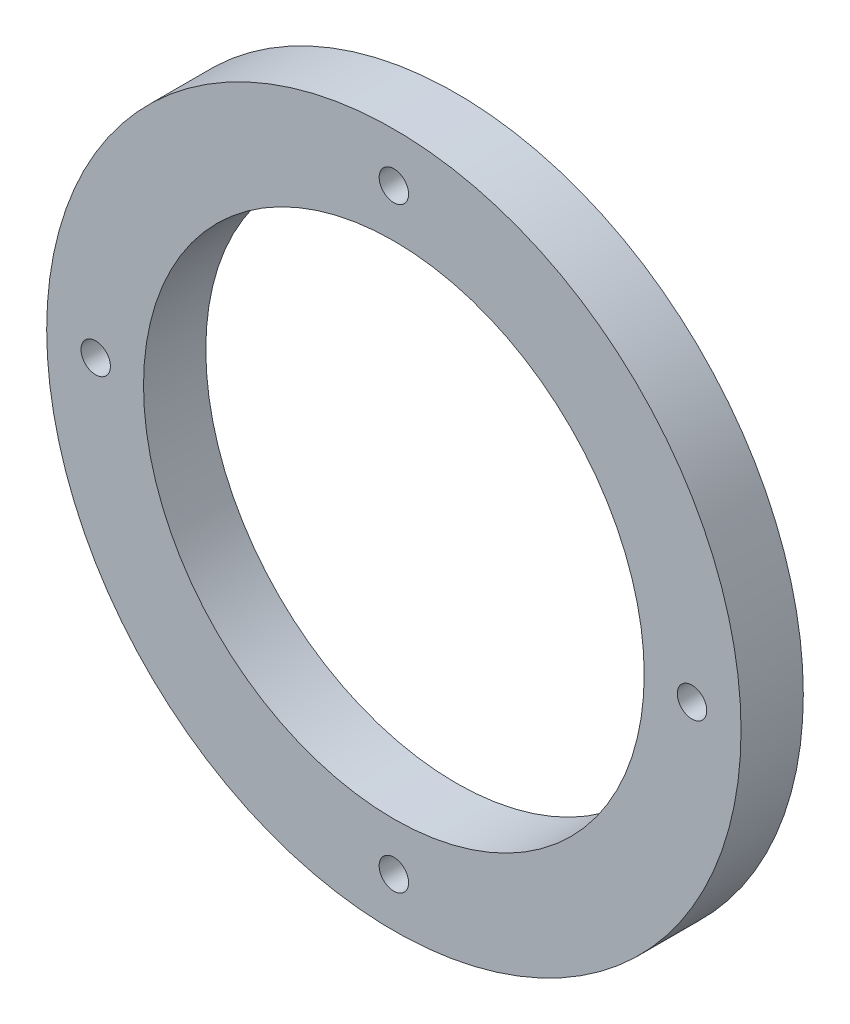
ISO-10303-21;
HEADER;
FILE_DESCRIPTION(('STEP AP214'),'2;1');
FILE_NAME('part.step','',(''),(''),'','','');
FILE_SCHEMA(('AUTOMOTIVE_DESIGN { 1 0 10303 214 1 1 1 1 }'));
ENDSEC;
DATA;
#1=APPLICATION_CONTEXT('core data for automotive mechanical design processes');
#2=APPLICATION_PROTOCOL_DEFINITION('international standard','automotive_design',2000,#1);
#3=PRODUCT_CONTEXT('',#1,'mechanical');
#4=PRODUCT('Part','Part','',(#3));
#5=PRODUCT_RELATED_PRODUCT_CATEGORY('part','',(#4));
#6=PRODUCT_DEFINITION_FORMATION('','',#4);
#7=PRODUCT_DEFINITION_CONTEXT('part definition',#1,'design');
#8=PRODUCT_DEFINITION('design','',#6,#7);
#9=PRODUCT_DEFINITION_SHAPE('','',#8);
#10=(LENGTH_UNIT() NAMED_UNIT(*) SI_UNIT(.MILLI.,.METRE.));
#11=(NAMED_UNIT(*) PLANE_ANGLE_UNIT() SI_UNIT($,.RADIAN.));
#12=(NAMED_UNIT(*) SI_UNIT($,.STERADIAN.) SOLID_ANGLE_UNIT());
#13=UNCERTAINTY_MEASURE_WITH_UNIT(LENGTH_MEASURE(1.E-05),#10,'distance_accuracy_value','');
#14=(GEOMETRIC_REPRESENTATION_CONTEXT(3) GLOBAL_UNCERTAINTY_ASSIGNED_CONTEXT((#13)) GLOBAL_UNIT_ASSIGNED_CONTEXT((#10,
#11,#12)) REPRESENTATION_CONTEXT('',''));
#15=CARTESIAN_POINT('',(0.,0.,0.));
#16=DIRECTION('',(0.,0.,1.));
#17=DIRECTION('',(1.,0.,0.));
#18=AXIS2_PLACEMENT_3D('',#15,#16,#17);
#19=CARTESIAN_POINT('',(0.,0.,6.35));
#20=DIRECTION('',(0.,0.,-1.));
#21=DIRECTION('',(-1.,0.,0.));
#22=AXIS2_PLACEMENT_3D('',#19,#20,#21);
#23=CYLINDRICAL_SURFACE('',#22,35.399999939);
#24=CARTESIAN_POINT('',(0.,0.,6.35));
#25=DIRECTION('',(0.,0.,1.));
#26=DIRECTION('',(1.,0.,0.));
#27=AXIS2_PLACEMENT_3D('',#24,#25,#26);
#28=CIRCLE('',#27,35.399999939);
#29=CARTESIAN_POINT('',(35.399999939,0.,6.35));
#30=VERTEX_POINT('',#29);
#31=EDGE_CURVE('E10',#30,#30,#28,.T.);
#32=ORIENTED_EDGE('',*,*,#31,.F.);
#33=EDGE_LOOP('',(#32));
#34=FACE_BOUND('',#33,.T.);
#35=CARTESIAN_POINT('',(0.,0.,0.));
#36=DIRECTION('',(0.,0.,1.));
#37=DIRECTION('',(1.,0.,0.));
#38=AXIS2_PLACEMENT_3D('',#35,#36,#37);
#39=CIRCLE('',#38,35.399999939);
#40=CARTESIAN_POINT('',(35.399999939,0.,0.));
#41=VERTEX_POINT('',#40);
#42=EDGE_CURVE('E34',#41,#41,#39,.T.);
#43=ORIENTED_EDGE('',*,*,#42,.T.);
#44=EDGE_LOOP('',(#43));
#45=FACE_BOUND('',#44,.T.);
#46=ADVANCED_FACE('F31',(#34,#45),#23,.T.);
#47=CARTESIAN_POINT('',(0.,0.,6.35));
#48=DIRECTION('',(0.,0.,1.));
#49=DIRECTION('',(1.,0.,0.));
#50=AXIS2_PLACEMENT_3D('',#47,#48,#49);
#51=PLANE('',#50);
#52=CARTESIAN_POINT('',(0.,30.400000033,6.35));
#53=DIRECTION('',(0.,0.,1.));
#54=DIRECTION('',(1.,0.,0.));
#55=AXIS2_PLACEMENT_3D('',#52,#53,#54);
#56=CIRCLE('',#55,1.5);
#57=CARTESIAN_POINT('',(1.5,30.400000033,6.35));
#58=VERTEX_POINT('',#57);
#59=EDGE_CURVE('E67',#58,#58,#56,.T.);
#60=ORIENTED_EDGE('',*,*,#59,.F.);
#61=EDGE_LOOP('',(#60));
#62=FACE_BOUND('',#61,.T.);
#63=CARTESIAN_POINT('',(30.400000033,0.,6.35));
#64=DIRECTION('',(0.,0.,1.));
#65=DIRECTION('',(1.,0.,0.));
#66=AXIS2_PLACEMENT_3D('',#63,#64,#65);
#67=CIRCLE('',#66,1.5);
#68=CARTESIAN_POINT('',(31.900000033,0.,6.35));
#69=VERTEX_POINT('',#68);
#70=EDGE_CURVE('E64',#69,#69,#67,.T.);
#71=ORIENTED_EDGE('',*,*,#70,.F.);
#72=EDGE_LOOP('',(#71));
#73=FACE_BOUND('',#72,.T.);
#74=CARTESIAN_POINT('',(0.,-30.400000033,6.35));
#75=DIRECTION('',(0.,0.,1.));
#76=DIRECTION('',(1.,0.,0.));
#77=AXIS2_PLACEMENT_3D('',#74,#75,#76);
#78=CIRCLE('',#77,1.5);
#79=CARTESIAN_POINT('',(1.5,-30.400000033,6.35));
#80=VERTEX_POINT('',#79);
#81=EDGE_CURVE('E58',#80,#80,#78,.T.);
#82=ORIENTED_EDGE('',*,*,#81,.F.);
#83=EDGE_LOOP('',(#82));
#84=FACE_BOUND('',#83,.T.);
#85=CARTESIAN_POINT('',(-30.400000033,0.,6.35));
#86=DIRECTION('',(0.,0.,1.));
#87=DIRECTION('',(1.,0.,0.));
#88=AXIS2_PLACEMENT_3D('',#85,#86,#87);
#89=CIRCLE('',#88,1.5);
#90=CARTESIAN_POINT('',(-28.900000033,0.,6.35));
#91=VERTEX_POINT('',#90);
#92=EDGE_CURVE('E52',#91,#91,#89,.T.);
#93=ORIENTED_EDGE('',*,*,#92,.F.);
#94=EDGE_LOOP('',(#93));
#95=FACE_BOUND('',#94,.T.);
#96=CARTESIAN_POINT('',(0.,0.,6.35));
#97=DIRECTION('',(0.,0.,1.));
#98=DIRECTION('',(1.,0.,0.));
#99=AXIS2_PLACEMENT_3D('',#96,#97,#98);
#100=CIRCLE('',#99,25.527);
#101=CARTESIAN_POINT('',(25.527,0.,6.35));
#102=VERTEX_POINT('',#101);
#103=EDGE_CURVE('E43',#102,#102,#100,.T.);
#104=ORIENTED_EDGE('',*,*,#103,.F.);
#105=EDGE_LOOP('',(#104));
#106=FACE_BOUND('',#105,.T.);
#107=ORIENTED_EDGE('',*,*,#31,.T.);
#108=EDGE_LOOP('',(#107));
#109=FACE_BOUND('',#108,.T.);
#110=ADVANCED_FACE('F83',(#62,#73,#84,#95,#106,#109),#51,.T.);
#111=CARTESIAN_POINT('',(0.,0.,0.));
#112=DIRECTION('',(0.,0.,1.));
#113=DIRECTION('',(1.,0.,0.));
#114=AXIS2_PLACEMENT_3D('',#111,#112,#113);
#115=PLANE('',#114);
#116=CARTESIAN_POINT('',(0.,30.400000033,0.));
#117=DIRECTION('',(0.,0.,1.));
#118=DIRECTION('',(1.,0.,0.));
#119=AXIS2_PLACEMENT_3D('',#116,#117,#118);
#120=CIRCLE('',#119,1.5);
#121=CARTESIAN_POINT('',(1.5,30.400000033,0.));
#122=VERTEX_POINT('',#121);
#123=EDGE_CURVE('E46',#122,#122,#120,.T.);
#124=ORIENTED_EDGE('',*,*,#123,.T.);
#125=EDGE_LOOP('',(#124));
#126=FACE_BOUND('',#125,.T.);
#127=CARTESIAN_POINT('',(30.400000033,0.,0.));
#128=DIRECTION('',(0.,0.,1.));
#129=DIRECTION('',(1.,0.,0.));
#130=AXIS2_PLACEMENT_3D('',#127,#128,#129);
#131=CIRCLE('',#130,1.5);
#132=CARTESIAN_POINT('',(31.900000033,0.,0.));
#133=VERTEX_POINT('',#132);
#134=EDGE_CURVE('E61',#133,#133,#131,.T.);
#135=ORIENTED_EDGE('',*,*,#134,.T.);
#136=EDGE_LOOP('',(#135));
#137=FACE_BOUND('',#136,.T.);
#138=CARTESIAN_POINT('',(0.,-30.400000033,0.));
#139=DIRECTION('',(0.,0.,1.));
#140=DIRECTION('',(1.,0.,0.));
#141=AXIS2_PLACEMENT_3D('',#138,#139,#140);
#142=CIRCLE('',#141,1.5);
#143=CARTESIAN_POINT('',(1.5,-30.400000033,0.));
#144=VERTEX_POINT('',#143);
#145=EDGE_CURVE('E55',#144,#144,#142,.T.);
#146=ORIENTED_EDGE('',*,*,#145,.T.);
#147=EDGE_LOOP('',(#146));
#148=FACE_BOUND('',#147,.T.);
#149=CARTESIAN_POINT('',(-30.400000033,0.,0.));
#150=DIRECTION('',(0.,0.,1.));
#151=DIRECTION('',(1.,0.,0.));
#152=AXIS2_PLACEMENT_3D('',#149,#150,#151);
#153=CIRCLE('',#152,1.5);
#154=CARTESIAN_POINT('',(-28.900000033,0.,0.));
#155=VERTEX_POINT('',#154);
#156=EDGE_CURVE('E49',#155,#155,#153,.T.);
#157=ORIENTED_EDGE('',*,*,#156,.T.);
#158=EDGE_LOOP('',(#157));
#159=FACE_BOUND('',#158,.T.);
#160=CARTESIAN_POINT('',(0.,0.,0.));
#161=DIRECTION('',(0.,0.,1.));
#162=DIRECTION('',(1.,0.,0.));
#163=AXIS2_PLACEMENT_3D('',#160,#161,#162);
#164=CIRCLE('',#163,25.527);
#165=CARTESIAN_POINT('',(25.527,0.,0.));
#166=VERTEX_POINT('',#165);
#167=EDGE_CURVE('E41',#166,#166,#164,.T.);
#168=ORIENTED_EDGE('',*,*,#167,.T.);
#169=EDGE_LOOP('',(#168));
#170=FACE_BOUND('',#169,.T.);
#171=ORIENTED_EDGE('',*,*,#42,.F.);
#172=EDGE_LOOP('',(#171));
#173=FACE_BOUND('',#172,.T.);
#174=ADVANCED_FACE('F73',(#126,#137,#148,#159,#170,#173),#115,.F.);
#175=CARTESIAN_POINT('',(0.,0.,0.));
#176=DIRECTION('',(0.,0.,1.));
#177=DIRECTION('',(1.,0.,0.));
#178=AXIS2_PLACEMENT_3D('',#175,#176,#177);
#179=CYLINDRICAL_SURFACE('',#178,25.527);
#180=ORIENTED_EDGE('',*,*,#167,.F.);
#181=EDGE_LOOP('',(#180));
#182=FACE_BOUND('',#181,.T.);
#183=ORIENTED_EDGE('',*,*,#103,.T.);
#184=EDGE_LOOP('',(#183));
#185=FACE_BOUND('',#184,.T.);
#186=ADVANCED_FACE('F95',(#182,#185),#179,.F.);
#187=CARTESIAN_POINT('',(-30.400000033,0.,0.));
#188=DIRECTION('',(0.,0.,1.));
#189=DIRECTION('',(1.,0.,0.));
#190=AXIS2_PLACEMENT_3D('',#187,#188,#189);
#191=CYLINDRICAL_SURFACE('',#190,1.5);
#192=ORIENTED_EDGE('',*,*,#156,.F.);
#193=EDGE_LOOP('',(#192));
#194=FACE_BOUND('',#193,.T.);
#195=ORIENTED_EDGE('',*,*,#92,.T.);
#196=EDGE_LOOP('',(#195));
#197=FACE_BOUND('',#196,.T.);
#198=ADVANCED_FACE('F97',(#194,#197),#191,.F.);
#199=CARTESIAN_POINT('',(0.,-30.400000033,0.));
#200=DIRECTION('',(0.,0.,1.));
#201=DIRECTION('',(1.,0.,0.));
#202=AXIS2_PLACEMENT_3D('',#199,#200,#201);
#203=CYLINDRICAL_SURFACE('',#202,1.5);
#204=ORIENTED_EDGE('',*,*,#145,.F.);
#205=EDGE_LOOP('',(#204));
#206=FACE_BOUND('',#205,.T.);
#207=ORIENTED_EDGE('',*,*,#81,.T.);
#208=EDGE_LOOP('',(#207));
#209=FACE_BOUND('',#208,.T.);
#210=ADVANCED_FACE('F104',(#206,#209),#203,.F.);
#211=CARTESIAN_POINT('',(30.400000033,0.,0.));
#212=DIRECTION('',(0.,0.,1.));
#213=DIRECTION('',(1.,0.,0.));
#214=AXIS2_PLACEMENT_3D('',#211,#212,#213);
#215=CYLINDRICAL_SURFACE('',#214,1.5);
#216=ORIENTED_EDGE('',*,*,#134,.F.);
#217=EDGE_LOOP('',(#216));
#218=FACE_BOUND('',#217,.T.);
#219=ORIENTED_EDGE('',*,*,#70,.T.);
#220=EDGE_LOOP('',(#219));
#221=FACE_BOUND('',#220,.T.);
#222=ADVANCED_FACE('F79',(#218,#221),#215,.F.);
#223=CARTESIAN_POINT('',(0.,30.400000033,0.));
#224=DIRECTION('',(0.,0.,1.));
#225=DIRECTION('',(1.,0.,0.));
#226=AXIS2_PLACEMENT_3D('',#223,#224,#225);
#227=CYLINDRICAL_SURFACE('',#226,1.5);
#228=ORIENTED_EDGE('',*,*,#123,.F.);
#229=EDGE_LOOP('',(#228));
#230=FACE_BOUND('',#229,.T.);
#231=ORIENTED_EDGE('',*,*,#59,.T.);
#232=EDGE_LOOP('',(#231));
#233=FACE_BOUND('',#232,.T.);
#234=ADVANCED_FACE('F76',(#230,#233),#227,.F.);
#235=CLOSED_SHELL('',(#46,#110,#174,#186,#198,#210,#222,#234));
#236=MANIFOLD_SOLID_BREP('B2',#235);
#237=ADVANCED_BREP_SHAPE_REPRESENTATION('',(#18,#236),#14);
#238=SHAPE_DEFINITION_REPRESENTATION(#9,#237);
ENDSEC;
END-ISO-10303-21;
